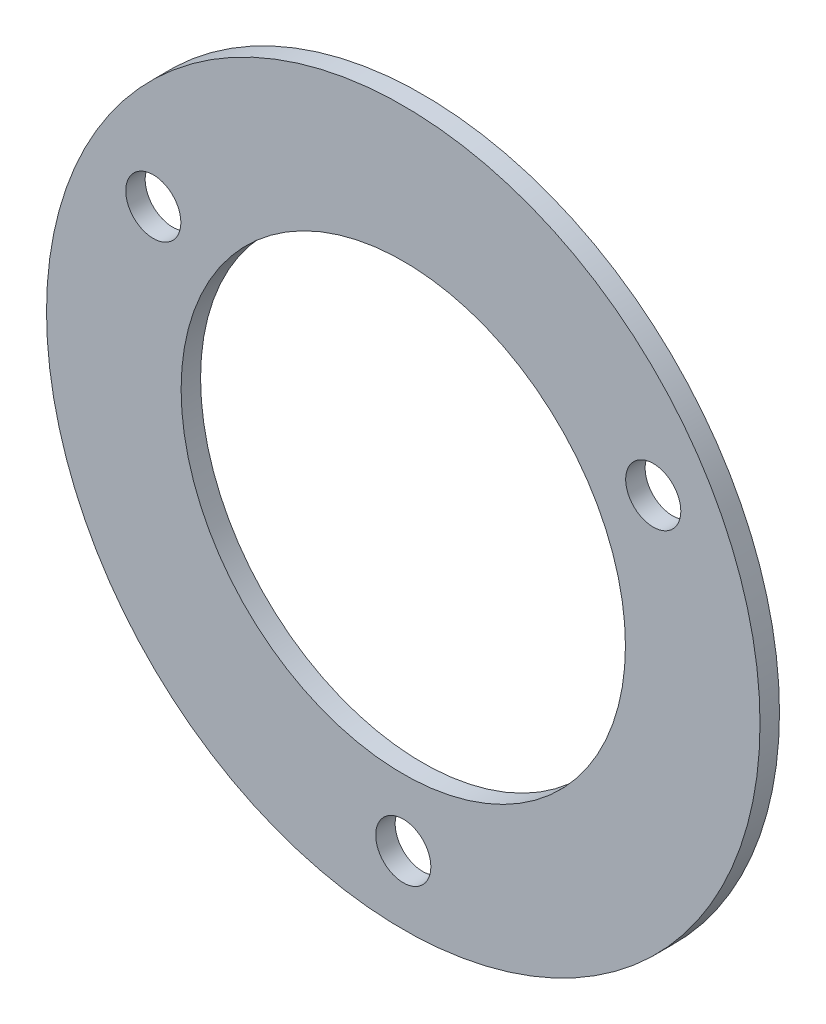
ISO-10303-21;
HEADER;
FILE_DESCRIPTION(('STEP AP214'),'2;1');
FILE_NAME('part.step','',(''),(''),'','','');
FILE_SCHEMA(('AUTOMOTIVE_DESIGN { 1 0 10303 214 1 1 1 1 }'));
ENDSEC;
DATA;
#1=APPLICATION_CONTEXT('core data for automotive mechanical design processes');
#2=APPLICATION_PROTOCOL_DEFINITION('international standard','automotive_design',2000,#1);
#3=PRODUCT_CONTEXT('',#1,'mechanical');
#4=PRODUCT('Part','Part','',(#3));
#5=PRODUCT_RELATED_PRODUCT_CATEGORY('part','',(#4));
#6=PRODUCT_DEFINITION_FORMATION('','',#4);
#7=PRODUCT_DEFINITION_CONTEXT('part definition',#1,'design');
#8=PRODUCT_DEFINITION('design','',#6,#7);
#9=PRODUCT_DEFINITION_SHAPE('','',#8);
#10=(LENGTH_UNIT() NAMED_UNIT(*) SI_UNIT(.MILLI.,.METRE.));
#11=(NAMED_UNIT(*) PLANE_ANGLE_UNIT() SI_UNIT($,.RADIAN.));
#12=(NAMED_UNIT(*) SI_UNIT($,.STERADIAN.) SOLID_ANGLE_UNIT());
#13=UNCERTAINTY_MEASURE_WITH_UNIT(LENGTH_MEASURE(1.E-05),#10,'distance_accuracy_value','');
#14=(GEOMETRIC_REPRESENTATION_CONTEXT(3) GLOBAL_UNCERTAINTY_ASSIGNED_CONTEXT((#13)) GLOBAL_UNIT_ASSIGNED_CONTEXT((#10,
#11,#12)) REPRESENTATION_CONTEXT('',''));
#15=CARTESIAN_POINT('',(0.,0.,0.));
#16=DIRECTION('',(0.,0.,1.));
#17=DIRECTION('',(1.,0.,0.));
#18=AXIS2_PLACEMENT_3D('',#15,#16,#17);
#19=CARTESIAN_POINT('',(0.,0.,-6.));
#20=DIRECTION('',(0.,0.,1.));
#21=DIRECTION('',(1.,0.,0.));
#22=AXIS2_PLACEMENT_3D('',#19,#20,#21);
#23=CYLINDRICAL_SURFACE('',#22,110.);
#24=CARTESIAN_POINT('',(0.,0.,-6.));
#25=DIRECTION('',(0.,0.,1.));
#26=DIRECTION('',(1.,0.,0.));
#27=AXIS2_PLACEMENT_3D('',#24,#25,#26);
#28=CIRCLE('',#27,110.);
#29=CARTESIAN_POINT('',(110.,0.,-6.));
#30=VERTEX_POINT('',#29);
#31=EDGE_CURVE('E10',#30,#30,#28,.T.);
#32=ORIENTED_EDGE('',*,*,#31,.T.);
#33=EDGE_LOOP('',(#32));
#34=FACE_BOUND('',#33,.T.);
#35=CARTESIAN_POINT('',(0.,0.,0.));
#36=DIRECTION('',(0.,0.,1.));
#37=DIRECTION('',(1.,0.,0.));
#38=AXIS2_PLACEMENT_3D('',#35,#36,#37);
#39=CIRCLE('',#38,110.);
#40=CARTESIAN_POINT('',(110.,0.,0.));
#41=VERTEX_POINT('',#40);
#42=EDGE_CURVE('E50',#41,#41,#39,.T.);
#43=ORIENTED_EDGE('',*,*,#42,.F.);
#44=EDGE_LOOP('',(#43));
#45=FACE_BOUND('',#44,.T.);
#46=ADVANCED_FACE('F47',(#34,#45),#23,.T.);
#47=CARTESIAN_POINT('',(0.,0.,-6.));
#48=DIRECTION('',(0.,0.,1.));
#49=DIRECTION('',(1.,0.,0.));
#50=AXIS2_PLACEMENT_3D('',#47,#48,#49);
#51=PLANE('',#50);
#52=CARTESIAN_POINT('',(-77.0762609368145,44.5000000000009,-6.));
#53=DIRECTION('',(0.,0.,1.));
#54=DIRECTION('',(1.,0.,0.));
#55=AXIS2_PLACEMENT_3D('',#52,#53,#54);
#56=CIRCLE('',#55,8.5);
#57=CARTESIAN_POINT('',(-68.5762609368145,44.5000000000009,-6.));
#58=VERTEX_POINT('',#57);
#59=EDGE_CURVE('E82',#58,#58,#56,.T.);
#60=ORIENTED_EDGE('',*,*,#59,.T.);
#61=EDGE_LOOP('',(#60));
#62=FACE_BOUND('',#61,.T.);
#63=CARTESIAN_POINT('',(-6.21483678314078E-13,-89.,-6.));
#64=DIRECTION('',(0.,0.,1.));
#65=DIRECTION('',(1.,0.,0.));
#66=AXIS2_PLACEMENT_3D('',#63,#64,#65);
#67=CIRCLE('',#66,8.5);
#68=CARTESIAN_POINT('',(8.49999999999938,-89.,-6.));
#69=VERTEX_POINT('',#68);
#70=EDGE_CURVE('E74',#69,#69,#67,.T.);
#71=ORIENTED_EDGE('',*,*,#70,.T.);
#72=EDGE_LOOP('',(#71));
#73=FACE_BOUND('',#72,.T.);
#74=CARTESIAN_POINT('',(77.0762609368151,44.4999999999998,-6.));
#75=DIRECTION('',(0.,0.,1.));
#76=DIRECTION('',(1.,0.,0.));
#77=AXIS2_PLACEMENT_3D('',#74,#75,#76);
#78=CIRCLE('',#77,8.50000000000003);
#79=CARTESIAN_POINT('',(85.5762609368152,44.4999999999998,-6.));
#80=VERTEX_POINT('',#79);
#81=EDGE_CURVE('E66',#80,#80,#78,.T.);
#82=ORIENTED_EDGE('',*,*,#81,.T.);
#83=EDGE_LOOP('',(#82));
#84=FACE_BOUND('',#83,.T.);
#85=CARTESIAN_POINT('',(0.,0.,-6.));
#86=DIRECTION('',(0.,0.,1.));
#87=DIRECTION('',(1.,0.,0.));
#88=AXIS2_PLACEMENT_3D('',#85,#86,#87);
#89=CIRCLE('',#88,68.5);
#90=CARTESIAN_POINT('',(68.5,0.,-6.));
#91=VERTEX_POINT('',#90);
#92=EDGE_CURVE('E60',#91,#91,#89,.T.);
#93=ORIENTED_EDGE('',*,*,#92,.T.);
#94=EDGE_LOOP('',(#93));
#95=FACE_BOUND('',#94,.T.);
#96=ORIENTED_EDGE('',*,*,#31,.F.);
#97=EDGE_LOOP('',(#96));
#98=FACE_BOUND('',#97,.T.);
#99=ADVANCED_FACE('F95',(#62,#73,#84,#95,#98),#51,.F.);
#100=CARTESIAN_POINT('',(0.,0.,0.));
#101=DIRECTION('',(0.,0.,1.));
#102=DIRECTION('',(1.,0.,0.));
#103=AXIS2_PLACEMENT_3D('',#100,#101,#102);
#104=PLANE('',#103);
#105=CARTESIAN_POINT('',(-77.0762609368145,44.5000000000009,0.));
#106=DIRECTION('',(0.,0.,1.));
#107=DIRECTION('',(1.,0.,0.));
#108=AXIS2_PLACEMENT_3D('',#105,#106,#107);
#109=CIRCLE('',#108,8.5);
#110=CARTESIAN_POINT('',(-68.5762609368145,44.5000000000009,0.));
#111=VERTEX_POINT('',#110);
#112=EDGE_CURVE('E86',#111,#111,#109,.T.);
#113=ORIENTED_EDGE('',*,*,#112,.F.);
#114=EDGE_LOOP('',(#113));
#115=FACE_BOUND('',#114,.T.);
#116=CARTESIAN_POINT('',(-6.21483678314078E-13,-89.,0.));
#117=DIRECTION('',(0.,0.,1.));
#118=DIRECTION('',(1.,0.,0.));
#119=AXIS2_PLACEMENT_3D('',#116,#117,#118);
#120=CIRCLE('',#119,8.5);
#121=CARTESIAN_POINT('',(8.49999999999938,-89.,0.));
#122=VERTEX_POINT('',#121);
#123=EDGE_CURVE('E78',#122,#122,#120,.T.);
#124=ORIENTED_EDGE('',*,*,#123,.F.);
#125=EDGE_LOOP('',(#124));
#126=FACE_BOUND('',#125,.T.);
#127=CARTESIAN_POINT('',(77.0762609368151,44.4999999999998,0.));
#128=DIRECTION('',(0.,0.,1.));
#129=DIRECTION('',(1.,0.,0.));
#130=AXIS2_PLACEMENT_3D('',#127,#128,#129);
#131=CIRCLE('',#130,8.50000000000003);
#132=CARTESIAN_POINT('',(85.5762609368152,44.4999999999998,0.));
#133=VERTEX_POINT('',#132);
#134=EDGE_CURVE('E70',#133,#133,#131,.T.);
#135=ORIENTED_EDGE('',*,*,#134,.F.);
#136=EDGE_LOOP('',(#135));
#137=FACE_BOUND('',#136,.T.);
#138=CARTESIAN_POINT('',(0.,0.,0.));
#139=DIRECTION('',(0.,0.,1.));
#140=DIRECTION('',(1.,0.,0.));
#141=AXIS2_PLACEMENT_3D('',#138,#139,#140);
#142=CIRCLE('',#141,68.5);
#143=CARTESIAN_POINT('',(68.5,0.,0.));
#144=VERTEX_POINT('',#143);
#145=EDGE_CURVE('E62',#144,#144,#142,.T.);
#146=ORIENTED_EDGE('',*,*,#145,.F.);
#147=EDGE_LOOP('',(#146));
#148=FACE_BOUND('',#147,.T.);
#149=ORIENTED_EDGE('',*,*,#42,.T.);
#150=EDGE_LOOP('',(#149));
#151=FACE_BOUND('',#150,.T.);
#152=ADVANCED_FACE('F105',(#115,#126,#137,#148,#151),#104,.T.);
#153=CARTESIAN_POINT('',(0.,0.,-6.));
#154=DIRECTION('',(0.,0.,1.));
#155=DIRECTION('',(1.,0.,0.));
#156=AXIS2_PLACEMENT_3D('',#153,#154,#155);
#157=CYLINDRICAL_SURFACE('',#156,68.5);
#158=ORIENTED_EDGE('',*,*,#92,.F.);
#159=EDGE_LOOP('',(#158));
#160=FACE_BOUND('',#159,.T.);
#161=ORIENTED_EDGE('',*,*,#145,.T.);
#162=EDGE_LOOP('',(#161));
#163=FACE_BOUND('',#162,.T.);
#164=ADVANCED_FACE('F108',(#160,#163),#157,.F.);
#165=CARTESIAN_POINT('',(77.0762609368151,44.4999999999998,-6.));
#166=DIRECTION('',(0.,0.,1.));
#167=DIRECTION('',(1.,0.,0.));
#168=AXIS2_PLACEMENT_3D('',#165,#166,#167);
#169=CYLINDRICAL_SURFACE('',#168,8.50000000000003);
#170=ORIENTED_EDGE('',*,*,#81,.F.);
#171=EDGE_LOOP('',(#170));
#172=FACE_BOUND('',#171,.T.);
#173=ORIENTED_EDGE('',*,*,#134,.T.);
#174=EDGE_LOOP('',(#173));
#175=FACE_BOUND('',#174,.T.);
#176=ADVANCED_FACE('F127',(#172,#175),#169,.F.);
#177=CARTESIAN_POINT('',(-6.21483678314078E-13,-89.,-6.));
#178=DIRECTION('',(0.,0.,1.));
#179=DIRECTION('',(1.,0.,0.));
#180=AXIS2_PLACEMENT_3D('',#177,#178,#179);
#181=CYLINDRICAL_SURFACE('',#180,8.5);
#182=ORIENTED_EDGE('',*,*,#70,.F.);
#183=EDGE_LOOP('',(#182));
#184=FACE_BOUND('',#183,.T.);
#185=ORIENTED_EDGE('',*,*,#123,.T.);
#186=EDGE_LOOP('',(#185));
#187=FACE_BOUND('',#186,.T.);
#188=ADVANCED_FACE('F101',(#184,#187),#181,.F.);
#189=CARTESIAN_POINT('',(-77.0762609368145,44.5000000000009,-6.));
#190=DIRECTION('',(0.,0.,1.));
#191=DIRECTION('',(1.,0.,0.));
#192=AXIS2_PLACEMENT_3D('',#189,#190,#191);
#193=CYLINDRICAL_SURFACE('',#192,8.5);
#194=ORIENTED_EDGE('',*,*,#59,.F.);
#195=EDGE_LOOP('',(#194));
#196=FACE_BOUND('',#195,.T.);
#197=ORIENTED_EDGE('',*,*,#112,.T.);
#198=EDGE_LOOP('',(#197));
#199=FACE_BOUND('',#198,.T.);
#200=ADVANCED_FACE('F98',(#196,#199),#193,.F.);
#201=CLOSED_SHELL('',(#46,#99,#152,#164,#176,#188,#200));
#202=MANIFOLD_SOLID_BREP('B2',#201);
#203=ADVANCED_BREP_SHAPE_REPRESENTATION('',(#18,#202),#14);
#204=SHAPE_DEFINITION_REPRESENTATION(#9,#203);
ENDSEC;
END-ISO-10303-21;
